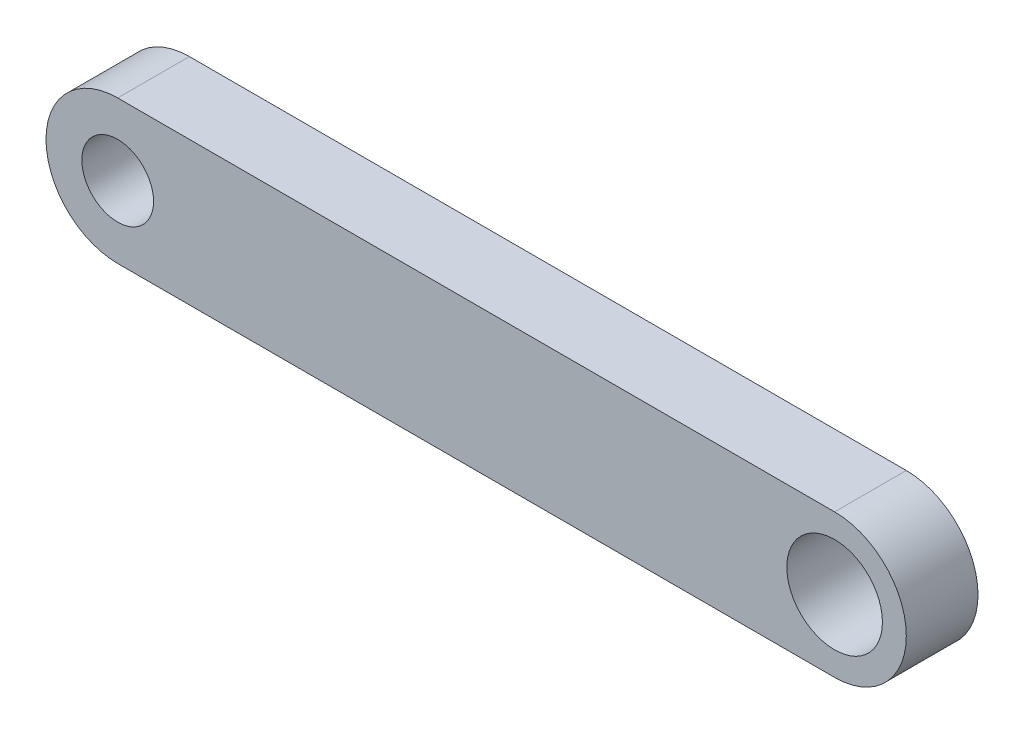
ISO-10303-21;
HEADER;
FILE_DESCRIPTION(('STEP AP214'),'2;1');
FILE_NAME('part.step','',(''),(''),'','','');
FILE_SCHEMA(('AUTOMOTIVE_DESIGN { 1 0 10303 214 1 1 1 1 }'));
ENDSEC;
DATA;
#1=APPLICATION_CONTEXT('core data for automotive mechanical design processes');
#2=APPLICATION_PROTOCOL_DEFINITION('international standard','automotive_design',2000,#1);
#3=PRODUCT_CONTEXT('',#1,'mechanical');
#4=PRODUCT('Part','Part','',(#3));
#5=PRODUCT_RELATED_PRODUCT_CATEGORY('part','',(#4));
#6=PRODUCT_DEFINITION_FORMATION('','',#4);
#7=PRODUCT_DEFINITION_CONTEXT('part definition',#1,'design');
#8=PRODUCT_DEFINITION('design','',#6,#7);
#9=PRODUCT_DEFINITION_SHAPE('','',#8);
#10=(LENGTH_UNIT() NAMED_UNIT(*) SI_UNIT(.MILLI.,.METRE.));
#11=(NAMED_UNIT(*) PLANE_ANGLE_UNIT() SI_UNIT($,.RADIAN.));
#12=(NAMED_UNIT(*) SI_UNIT($,.STERADIAN.) SOLID_ANGLE_UNIT());
#13=UNCERTAINTY_MEASURE_WITH_UNIT(LENGTH_MEASURE(1.E-05),#10,'distance_accuracy_value','');
#14=(GEOMETRIC_REPRESENTATION_CONTEXT(3) GLOBAL_UNCERTAINTY_ASSIGNED_CONTEXT((#13)) GLOBAL_UNIT_ASSIGNED_CONTEXT((#10,
#11,#12)) REPRESENTATION_CONTEXT('',''));
#15=CARTESIAN_POINT('',(0.,0.,0.));
#16=DIRECTION('',(0.,0.,1.));
#17=DIRECTION('',(1.,0.,0.));
#18=AXIS2_PLACEMENT_3D('',#15,#16,#17);
#19=CARTESIAN_POINT('',(-80.4404662558343,0.,30.));
#20=DIRECTION('',(0.,0.,1.));
#21=DIRECTION('',(1.,0.,0.));
#22=AXIS2_PLACEMENT_3D('',#19,#20,#21);
#23=PLANE('',#22);
#24=CARTESIAN_POINT('',(-80.4404662558343,0.,30.));
#25=DIRECTION('',(0.,0.,1.));
#26=DIRECTION('',(1.,0.,0.));
#27=AXIS2_PLACEMENT_3D('',#24,#25,#26);
#28=CIRCLE('',#27,15.);
#29=CARTESIAN_POINT('',(-65.4404662558343,0.,30.));
#30=VERTEX_POINT('',#29);
#31=EDGE_CURVE('E106',#30,#30,#28,.T.);
#32=ORIENTED_EDGE('',*,*,#31,.F.);
#33=EDGE_LOOP('',(#32));
#34=FACE_BOUND('',#33,.T.);
#35=CARTESIAN_POINT('',(-80.4404662558343,0.,30.));
#36=DIRECTION('',(0.,0.,1.));
#37=DIRECTION('',(1.,0.,0.));
#38=AXIS2_PLACEMENT_3D('',#35,#36,#37);
#39=CIRCLE('',#38,30.);
#40=CARTESIAN_POINT('',(-80.4404662558343,30.,30.));
#41=VERTEX_POINT('',#40);
#42=CARTESIAN_POINT('',(-80.4404662558343,-30.,30.));
#43=VERTEX_POINT('',#42);
#44=EDGE_CURVE('E91',#41,#43,#39,.T.);
#45=ORIENTED_EDGE('',*,*,#44,.T.);
#46=DIRECTION('',(1.,0.,0.));
#47=VECTOR('',#46,1.);
#48=CARTESIAN_POINT('',(-80.4404662558343,-30.,30.));
#49=LINE('',#48,#47);
#50=CARTESIAN_POINT('',(219.559533744166,-30.,30.));
#51=VERTEX_POINT('',#50);
#52=EDGE_CURVE('E86',#43,#51,#49,.T.);
#53=ORIENTED_EDGE('',*,*,#52,.T.);
#54=CARTESIAN_POINT('',(219.559533744166,0.,30.));
#55=DIRECTION('',(0.,0.,1.));
#56=DIRECTION('',(1.,0.,0.));
#57=AXIS2_PLACEMENT_3D('',#54,#55,#56);
#58=CIRCLE('',#57,30.);
#59=CARTESIAN_POINT('',(219.559533744166,30.,30.));
#60=VERTEX_POINT('',#59);
#61=EDGE_CURVE('E89',#51,#60,#58,.T.);
#62=ORIENTED_EDGE('',*,*,#61,.T.);
#63=DIRECTION('',(-1.,0.,0.));
#64=VECTOR('',#63,1.);
#65=CARTESIAN_POINT('',(-80.4404662558343,30.,30.));
#66=LINE('',#65,#64);
#67=EDGE_CURVE('E56',#60,#41,#66,.T.);
#68=ORIENTED_EDGE('',*,*,#67,.T.);
#69=EDGE_LOOP('',(#45,#53,#62,#68));
#70=FACE_BOUND('',#69,.T.);
#71=CARTESIAN_POINT('',(219.559533744166,0.,30.));
#72=DIRECTION('',(0.,0.,1.));
#73=DIRECTION('',(1.,0.,0.));
#74=AXIS2_PLACEMENT_3D('',#71,#72,#73);
#75=CIRCLE('',#74,20.);
#76=CARTESIAN_POINT('',(239.559533744166,0.,30.));
#77=VERTEX_POINT('',#76);
#78=EDGE_CURVE('E121',#77,#77,#75,.T.);
#79=ORIENTED_EDGE('',*,*,#78,.F.);
#80=EDGE_LOOP('',(#79));
#81=FACE_BOUND('',#80,.T.);
#82=ADVANCED_FACE('F39',(#34,#70,#81),#23,.T.);
#83=CARTESIAN_POINT('',(-80.4404662558343,0.,0.));
#84=DIRECTION('',(0.,0.,1.));
#85=DIRECTION('',(1.,0.,0.));
#86=AXIS2_PLACEMENT_3D('',#83,#84,#85);
#87=PLANE('',#86);
#88=CARTESIAN_POINT('',(-80.4404662558343,0.,0.));
#89=DIRECTION('',(0.,0.,1.));
#90=DIRECTION('',(1.,0.,0.));
#91=AXIS2_PLACEMENT_3D('',#88,#89,#90);
#92=CIRCLE('',#91,30.);
#93=CARTESIAN_POINT('',(-80.4404662558343,30.,0.));
#94=VERTEX_POINT('',#93);
#95=CARTESIAN_POINT('',(-80.4404662558343,-30.,0.));
#96=VERTEX_POINT('',#95);
#97=EDGE_CURVE('E103',#94,#96,#92,.T.);
#98=ORIENTED_EDGE('',*,*,#97,.F.);
#99=DIRECTION('',(-1.,0.,0.));
#100=VECTOR('',#99,1.);
#101=CARTESIAN_POINT('',(-80.4404662558343,30.,0.));
#102=LINE('',#101,#100);
#103=CARTESIAN_POINT('',(219.559533744166,30.,0.));
#104=VERTEX_POINT('',#103);
#105=EDGE_CURVE('E79',#104,#94,#102,.T.);
#106=ORIENTED_EDGE('',*,*,#105,.F.);
#107=CARTESIAN_POINT('',(219.559533744166,0.,0.));
#108=DIRECTION('',(0.,0.,1.));
#109=DIRECTION('',(1.,0.,0.));
#110=AXIS2_PLACEMENT_3D('',#107,#108,#109);
#111=CIRCLE('',#110,30.);
#112=CARTESIAN_POINT('',(219.559533744166,-30.,0.));
#113=VERTEX_POINT('',#112);
#114=EDGE_CURVE('E73',#113,#104,#111,.T.);
#115=ORIENTED_EDGE('',*,*,#114,.F.);
#116=DIRECTION('',(1.,0.,0.));
#117=VECTOR('',#116,1.);
#118=CARTESIAN_POINT('',(-80.4404662558343,-30.,0.));
#119=LINE('',#118,#117);
#120=EDGE_CURVE('E95',#96,#113,#119,.T.);
#121=ORIENTED_EDGE('',*,*,#120,.F.);
#122=EDGE_LOOP('',(#98,#106,#115,#121));
#123=FACE_BOUND('',#122,.T.);
#124=CARTESIAN_POINT('',(-80.4404662558343,0.,0.));
#125=DIRECTION('',(0.,0.,1.));
#126=DIRECTION('',(1.,0.,0.));
#127=AXIS2_PLACEMENT_3D('',#124,#125,#126);
#128=CIRCLE('',#127,15.);
#129=CARTESIAN_POINT('',(-65.4404662558343,0.,0.));
#130=VERTEX_POINT('',#129);
#131=EDGE_CURVE('E118',#130,#130,#128,.T.);
#132=ORIENTED_EDGE('',*,*,#131,.T.);
#133=EDGE_LOOP('',(#132));
#134=FACE_BOUND('',#133,.T.);
#135=CARTESIAN_POINT('',(219.559533744166,0.,0.));
#136=DIRECTION('',(0.,0.,1.));
#137=DIRECTION('',(1.,0.,0.));
#138=AXIS2_PLACEMENT_3D('',#135,#136,#137);
#139=CIRCLE('',#138,20.);
#140=CARTESIAN_POINT('',(239.559533744166,0.,0.));
#141=VERTEX_POINT('',#140);
#142=EDGE_CURVE('E124',#141,#141,#139,.T.);
#143=ORIENTED_EDGE('',*,*,#142,.T.);
#144=EDGE_LOOP('',(#143));
#145=FACE_BOUND('',#144,.T.);
#146=ADVANCED_FACE('F114',(#123,#134,#145),#87,.F.);
#147=CARTESIAN_POINT('',(-80.4404662558343,0.,30.));
#148=DIRECTION('',(0.,0.,-1.));
#149=DIRECTION('',(-1.,0.,0.));
#150=AXIS2_PLACEMENT_3D('',#147,#148,#149);
#151=CYLINDRICAL_SURFACE('',#150,30.);
#152=ORIENTED_EDGE('',*,*,#97,.T.);
#153=DIRECTION('',(0.,0.,-1.));
#154=VECTOR('',#153,1.);
#155=CARTESIAN_POINT('',(-80.4404662558343,-30.,30.));
#156=LINE('',#155,#154);
#157=EDGE_CURVE('E11',#43,#96,#156,.T.);
#158=ORIENTED_EDGE('',*,*,#157,.F.);
#159=ORIENTED_EDGE('',*,*,#44,.F.);
#160=DIRECTION('',(0.,0.,-1.));
#161=VECTOR('',#160,1.);
#162=CARTESIAN_POINT('',(-80.4404662558343,30.,30.));
#163=LINE('',#162,#161);
#164=EDGE_CURVE('E99',#41,#94,#163,.T.);
#165=ORIENTED_EDGE('',*,*,#164,.T.);
#166=EDGE_LOOP('',(#152,#158,#159,#165));
#167=FACE_BOUND('',#166,.T.);
#168=ADVANCED_FACE('F41',(#167),#151,.T.);
#169=CARTESIAN_POINT('',(-80.4404662558343,-30.,30.));
#170=DIRECTION('',(0.,1.,0.));
#171=DIRECTION('',(0.,0.,1.));
#172=AXIS2_PLACEMENT_3D('',#169,#170,#171);
#173=PLANE('',#172);
#174=ORIENTED_EDGE('',*,*,#120,.T.);
#175=DIRECTION('',(0.,0.,-1.));
#176=VECTOR('',#175,1.);
#177=CARTESIAN_POINT('',(219.559533744166,-30.,30.));
#178=LINE('',#177,#176);
#179=EDGE_CURVE('E48',#51,#113,#178,.T.);
#180=ORIENTED_EDGE('',*,*,#179,.F.);
#181=ORIENTED_EDGE('',*,*,#52,.F.);
#182=ORIENTED_EDGE('',*,*,#157,.T.);
#183=EDGE_LOOP('',(#174,#180,#181,#182));
#184=FACE_BOUND('',#183,.T.);
#185=ADVANCED_FACE('F94',(#184),#173,.F.);
#186=CARTESIAN_POINT('',(219.559533744166,0.,30.));
#187=DIRECTION('',(0.,0.,-1.));
#188=DIRECTION('',(-1.,0.,0.));
#189=AXIS2_PLACEMENT_3D('',#186,#187,#188);
#190=CYLINDRICAL_SURFACE('',#189,30.);
#191=ORIENTED_EDGE('',*,*,#114,.T.);
#192=DIRECTION('',(0.,0.,-1.));
#193=VECTOR('',#192,1.);
#194=CARTESIAN_POINT('',(219.559533744166,30.,30.));
#195=LINE('',#194,#193);
#196=EDGE_CURVE('E96',#60,#104,#195,.T.);
#197=ORIENTED_EDGE('',*,*,#196,.F.);
#198=ORIENTED_EDGE('',*,*,#61,.F.);
#199=ORIENTED_EDGE('',*,*,#179,.T.);
#200=EDGE_LOOP('',(#191,#197,#198,#199));
#201=FACE_BOUND('',#200,.T.);
#202=ADVANCED_FACE('F97',(#201),#190,.T.);
#203=CARTESIAN_POINT('',(-80.4404662558343,30.,30.));
#204=DIRECTION('',(0.,-1.,0.));
#205=DIRECTION('',(0.,0.,-1.));
#206=AXIS2_PLACEMENT_3D('',#203,#204,#205);
#207=PLANE('',#206);
#208=ORIENTED_EDGE('',*,*,#105,.T.);
#209=ORIENTED_EDGE('',*,*,#164,.F.);
#210=ORIENTED_EDGE('',*,*,#67,.F.);
#211=ORIENTED_EDGE('',*,*,#196,.T.);
#212=EDGE_LOOP('',(#208,#209,#210,#211));
#213=FACE_BOUND('',#212,.T.);
#214=ADVANCED_FACE('F111',(#213),#207,.F.);
#215=CARTESIAN_POINT('',(-80.4404662558343,0.,30.));
#216=DIRECTION('',(0.,0.,-1.));
#217=DIRECTION('',(-1.,0.,0.));
#218=AXIS2_PLACEMENT_3D('',#215,#216,#217);
#219=CYLINDRICAL_SURFACE('',#218,15.);
#220=ORIENTED_EDGE('',*,*,#31,.T.);
#221=EDGE_LOOP('',(#220));
#222=FACE_BOUND('',#221,.T.);
#223=ORIENTED_EDGE('',*,*,#131,.F.);
#224=EDGE_LOOP('',(#223));
#225=FACE_BOUND('',#224,.T.);
#226=ADVANCED_FACE('F141',(#222,#225),#219,.F.);
#227=CARTESIAN_POINT('',(219.559533744166,0.,30.));
#228=DIRECTION('',(0.,0.,-1.));
#229=DIRECTION('',(-1.,0.,0.));
#230=AXIS2_PLACEMENT_3D('',#227,#228,#229);
#231=CYLINDRICAL_SURFACE('',#230,20.);
#232=ORIENTED_EDGE('',*,*,#78,.T.);
#233=EDGE_LOOP('',(#232));
#234=FACE_BOUND('',#233,.T.);
#235=ORIENTED_EDGE('',*,*,#142,.F.);
#236=EDGE_LOOP('',(#235));
#237=FACE_BOUND('',#236,.T.);
#238=ADVANCED_FACE('F130',(#234,#237),#231,.F.);
#239=CLOSED_SHELL('',(#82,#146,#168,#185,#202,#214,#226,#238));
#240=MANIFOLD_SOLID_BREP('B2',#239);
#241=ADVANCED_BREP_SHAPE_REPRESENTATION('',(#18,#240),#14);
#242=SHAPE_DEFINITION_REPRESENTATION(#9,#241);
ENDSEC;
END-ISO-10303-21;
